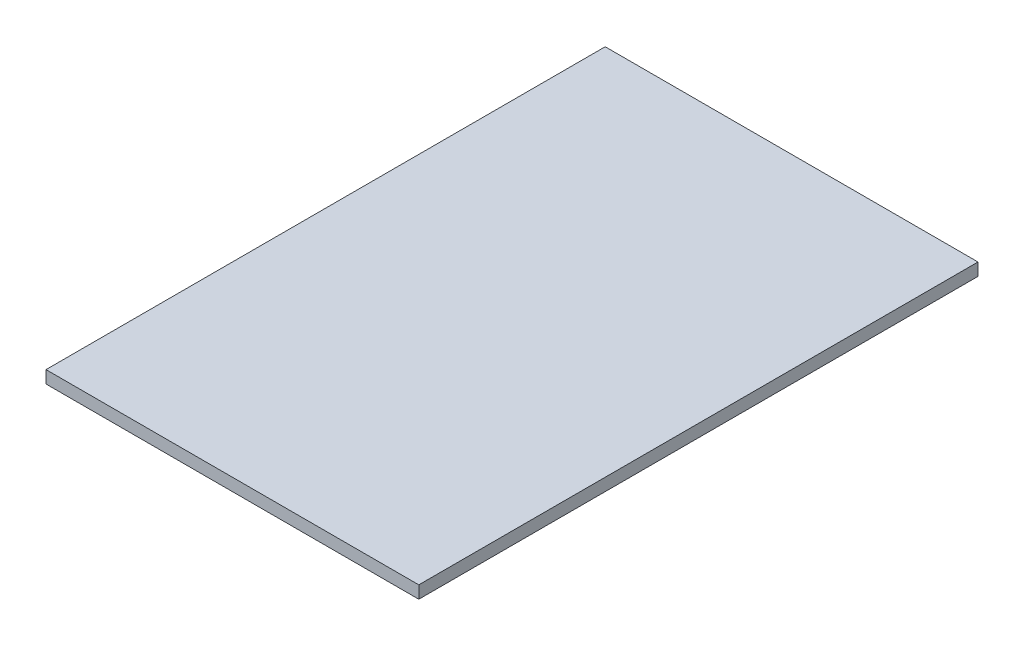
ISO-10303-21;
HEADER;
FILE_DESCRIPTION(('STEP AP214'),'2;1');
FILE_NAME('part.step','',(''),(''),'','','');
FILE_SCHEMA(('AUTOMOTIVE_DESIGN { 1 0 10303 214 1 1 1 1 }'));
ENDSEC;
DATA;
#1=APPLICATION_CONTEXT('core data for automotive mechanical design processes');
#2=APPLICATION_PROTOCOL_DEFINITION('international standard','automotive_design',2000,#1);
#3=PRODUCT_CONTEXT('',#1,'mechanical');
#4=PRODUCT('Part','Part','',(#3));
#5=PRODUCT_RELATED_PRODUCT_CATEGORY('part','',(#4));
#6=PRODUCT_DEFINITION_FORMATION('','',#4);
#7=PRODUCT_DEFINITION_CONTEXT('part definition',#1,'design');
#8=PRODUCT_DEFINITION('design','',#6,#7);
#9=PRODUCT_DEFINITION_SHAPE('','',#8);
#10=(LENGTH_UNIT() NAMED_UNIT(*) SI_UNIT(.MILLI.,.METRE.));
#11=(NAMED_UNIT(*) PLANE_ANGLE_UNIT() SI_UNIT($,.RADIAN.));
#12=(NAMED_UNIT(*) SI_UNIT($,.STERADIAN.) SOLID_ANGLE_UNIT());
#13=UNCERTAINTY_MEASURE_WITH_UNIT(LENGTH_MEASURE(1.E-05),#10,'distance_accuracy_value','');
#14=(GEOMETRIC_REPRESENTATION_CONTEXT(3) GLOBAL_UNCERTAINTY_ASSIGNED_CONTEXT((#13)) GLOBAL_UNIT_ASSIGNED_CONTEXT((#10,
#11,#12)) REPRESENTATION_CONTEXT('',''));
#15=CARTESIAN_POINT('',(0.,0.,0.));
#16=DIRECTION('',(0.,0.,1.));
#17=DIRECTION('',(1.,0.,0.));
#18=AXIS2_PLACEMENT_3D('',#15,#16,#17);
#19=CARTESIAN_POINT('',(0.,6.7,0.));
#20=DIRECTION('',(1.,0.,0.));
#21=DIRECTION('',(0.,0.,-1.));
#22=AXIS2_PLACEMENT_3D('',#19,#20,#21);
#23=PLANE('',#22);
#24=DIRECTION('',(0.,0.,1.));
#25=VECTOR('',#24,1.);
#26=CARTESIAN_POINT('',(0.,0.,0.));
#27=LINE('',#26,#25);
#28=CARTESIAN_POINT('',(0.,0.,-300.));
#29=VERTEX_POINT('',#28);
#30=CARTESIAN_POINT('',(0.,0.,0.));
#31=VERTEX_POINT('',#30);
#32=EDGE_CURVE('E97',#29,#31,#27,.T.);
#33=ORIENTED_EDGE('',*,*,#32,.T.);
#34=DIRECTION('',(0.,-1.,0.));
#35=VECTOR('',#34,1.);
#36=CARTESIAN_POINT('',(0.,6.7,0.));
#37=LINE('',#36,#35);
#38=CARTESIAN_POINT('',(0.,6.7,0.));
#39=VERTEX_POINT('',#38);
#40=EDGE_CURVE('E11',#39,#31,#37,.T.);
#41=ORIENTED_EDGE('',*,*,#40,.F.);
#42=DIRECTION('',(0.,0.,1.));
#43=VECTOR('',#42,1.);
#44=CARTESIAN_POINT('',(0.,6.7,0.));
#45=LINE('',#44,#43);
#46=CARTESIAN_POINT('',(0.,6.7,-300.));
#47=VERTEX_POINT('',#46);
#48=EDGE_CURVE('E85',#47,#39,#45,.T.);
#49=ORIENTED_EDGE('',*,*,#48,.F.);
#50=DIRECTION('',(0.,-1.,0.));
#51=VECTOR('',#50,1.);
#52=CARTESIAN_POINT('',(0.,6.7,-300.));
#53=LINE('',#52,#51);
#54=EDGE_CURVE('E93',#47,#29,#53,.T.);
#55=ORIENTED_EDGE('',*,*,#54,.T.);
#56=EDGE_LOOP('',(#33,#41,#49,#55));
#57=FACE_BOUND('',#56,.T.);
#58=ADVANCED_FACE('F34',(#57),#23,.F.);
#59=CARTESIAN_POINT('',(0.,6.7,0.));
#60=DIRECTION('',(0.,0.,-1.));
#61=DIRECTION('',(-1.,0.,0.));
#62=AXIS2_PLACEMENT_3D('',#59,#60,#61);
#63=PLANE('',#62);
#64=DIRECTION('',(1.,0.,0.));
#65=VECTOR('',#64,1.);
#66=CARTESIAN_POINT('',(0.,0.,0.));
#67=LINE('',#66,#65);
#68=CARTESIAN_POINT('',(200.,0.,0.));
#69=VERTEX_POINT('',#68);
#70=EDGE_CURVE('E89',#31,#69,#67,.T.);
#71=ORIENTED_EDGE('',*,*,#70,.T.);
#72=DIRECTION('',(0.,-1.,0.));
#73=VECTOR('',#72,1.);
#74=CARTESIAN_POINT('',(200.,6.7,0.));
#75=LINE('',#74,#73);
#76=CARTESIAN_POINT('',(200.,6.7,0.));
#77=VERTEX_POINT('',#76);
#78=EDGE_CURVE('E42',#77,#69,#75,.T.);
#79=ORIENTED_EDGE('',*,*,#78,.F.);
#80=DIRECTION('',(1.,0.,0.));
#81=VECTOR('',#80,1.);
#82=CARTESIAN_POINT('',(0.,6.7,0.));
#83=LINE('',#82,#81);
#84=EDGE_CURVE('E80',#39,#77,#83,.T.);
#85=ORIENTED_EDGE('',*,*,#84,.F.);
#86=ORIENTED_EDGE('',*,*,#40,.T.);
#87=EDGE_LOOP('',(#71,#79,#85,#86));
#88=FACE_BOUND('',#87,.T.);
#89=ADVANCED_FACE('F88',(#88),#63,.F.);
#90=CARTESIAN_POINT('',(200.,6.7,0.));
#91=DIRECTION('',(-1.,0.,0.));
#92=DIRECTION('',(0.,0.,1.));
#93=AXIS2_PLACEMENT_3D('',#90,#91,#92);
#94=PLANE('',#93);
#95=DIRECTION('',(0.,0.,-1.));
#96=VECTOR('',#95,1.);
#97=CARTESIAN_POINT('',(200.,0.,0.));
#98=LINE('',#97,#96);
#99=CARTESIAN_POINT('',(200.,0.,-300.));
#100=VERTEX_POINT('',#99);
#101=EDGE_CURVE('E67',#69,#100,#98,.T.);
#102=ORIENTED_EDGE('',*,*,#101,.T.);
#103=DIRECTION('',(0.,-1.,0.));
#104=VECTOR('',#103,1.);
#105=CARTESIAN_POINT('',(200.,6.7,-300.));
#106=LINE('',#105,#104);
#107=CARTESIAN_POINT('',(200.,6.7,-300.));
#108=VERTEX_POINT('',#107);
#109=EDGE_CURVE('E90',#108,#100,#106,.T.);
#110=ORIENTED_EDGE('',*,*,#109,.F.);
#111=DIRECTION('',(0.,0.,-1.));
#112=VECTOR('',#111,1.);
#113=CARTESIAN_POINT('',(200.,6.7,0.));
#114=LINE('',#113,#112);
#115=EDGE_CURVE('E83',#77,#108,#114,.T.);
#116=ORIENTED_EDGE('',*,*,#115,.F.);
#117=ORIENTED_EDGE('',*,*,#78,.T.);
#118=EDGE_LOOP('',(#102,#110,#116,#117));
#119=FACE_BOUND('',#118,.T.);
#120=ADVANCED_FACE('F91',(#119),#94,.F.);
#121=CARTESIAN_POINT('',(0.,6.7,-300.));
#122=DIRECTION('',(0.,0.,1.));
#123=DIRECTION('',(1.,0.,0.));
#124=AXIS2_PLACEMENT_3D('',#121,#122,#123);
#125=PLANE('',#124);
#126=DIRECTION('',(-1.,0.,0.));
#127=VECTOR('',#126,1.);
#128=CARTESIAN_POINT('',(0.,0.,-300.));
#129=LINE('',#128,#127);
#130=EDGE_CURVE('E73',#100,#29,#129,.T.);
#131=ORIENTED_EDGE('',*,*,#130,.T.);
#132=ORIENTED_EDGE('',*,*,#54,.F.);
#133=DIRECTION('',(-1.,0.,0.));
#134=VECTOR('',#133,1.);
#135=CARTESIAN_POINT('',(0.,6.7,-300.));
#136=LINE('',#135,#134);
#137=EDGE_CURVE('E50',#108,#47,#136,.T.);
#138=ORIENTED_EDGE('',*,*,#137,.F.);
#139=ORIENTED_EDGE('',*,*,#109,.T.);
#140=EDGE_LOOP('',(#131,#132,#138,#139));
#141=FACE_BOUND('',#140,.T.);
#142=ADVANCED_FACE('F104',(#141),#125,.F.);
#143=CARTESIAN_POINT('',(0.,6.7,0.));
#144=DIRECTION('',(0.,-1.,0.));
#145=DIRECTION('',(0.,0.,-1.));
#146=AXIS2_PLACEMENT_3D('',#143,#144,#145);
#147=PLANE('',#146);
#148=ORIENTED_EDGE('',*,*,#48,.T.);
#149=ORIENTED_EDGE('',*,*,#84,.T.);
#150=ORIENTED_EDGE('',*,*,#115,.T.);
#151=ORIENTED_EDGE('',*,*,#137,.T.);
#152=EDGE_LOOP('',(#148,#149,#150,#151));
#153=FACE_BOUND('',#152,.T.);
#154=ADVANCED_FACE('F81',(#153),#147,.F.);
#155=CARTESIAN_POINT('',(0.,0.,0.));
#156=DIRECTION('',(0.,-1.,0.));
#157=DIRECTION('',(0.,0.,-1.));
#158=AXIS2_PLACEMENT_3D('',#155,#156,#157);
#159=PLANE('',#158);
#160=ORIENTED_EDGE('',*,*,#32,.F.);
#161=ORIENTED_EDGE('',*,*,#130,.F.);
#162=ORIENTED_EDGE('',*,*,#101,.F.);
#163=ORIENTED_EDGE('',*,*,#70,.F.);
#164=EDGE_LOOP('',(#160,#161,#162,#163));
#165=FACE_BOUND('',#164,.T.);
#166=ADVANCED_FACE('F107',(#165),#159,.T.);
#167=CLOSED_SHELL('',(#58,#89,#120,#142,#154,#166));
#168=MANIFOLD_SOLID_BREP('B2',#167);
#169=ADVANCED_BREP_SHAPE_REPRESENTATION('',(#18,#168),#14);
#170=SHAPE_DEFINITION_REPRESENTATION(#9,#169);
ENDSEC;
END-ISO-10303-21;
